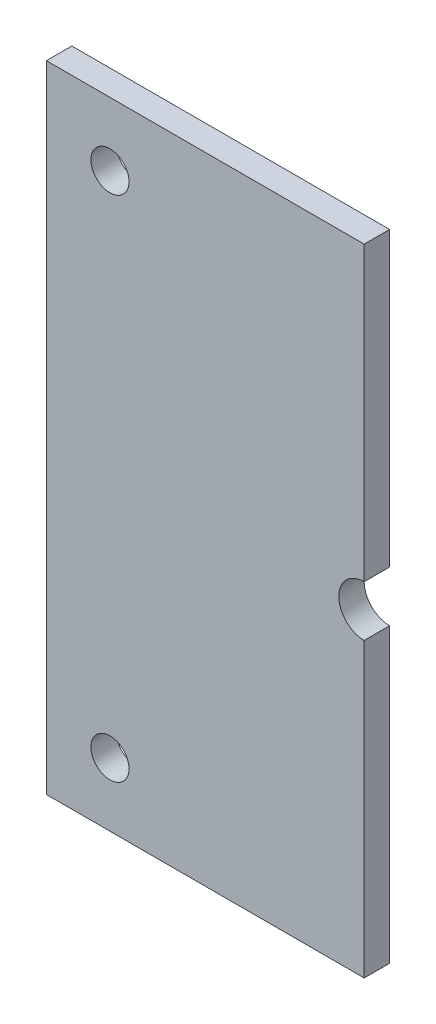
ISO-10303-21;
HEADER;
FILE_DESCRIPTION(('STEP AP214'),'2;1');
FILE_NAME('part.step','',(''),(''),'','','');
FILE_SCHEMA(('AUTOMOTIVE_DESIGN { 1 0 10303 214 1 1 1 1 }'));
ENDSEC;
DATA;
#1=APPLICATION_CONTEXT('core data for automotive mechanical design processes');
#2=APPLICATION_PROTOCOL_DEFINITION('international standard','automotive_design',2000,#1);
#3=PRODUCT_CONTEXT('',#1,'mechanical');
#4=PRODUCT('Part','Part','',(#3));
#5=PRODUCT_RELATED_PRODUCT_CATEGORY('part','',(#4));
#6=PRODUCT_DEFINITION_FORMATION('','',#4);
#7=PRODUCT_DEFINITION_CONTEXT('part definition',#1,'design');
#8=PRODUCT_DEFINITION('design','',#6,#7);
#9=PRODUCT_DEFINITION_SHAPE('','',#8);
#10=(LENGTH_UNIT() NAMED_UNIT(*) SI_UNIT(.MILLI.,.METRE.));
#11=(NAMED_UNIT(*) PLANE_ANGLE_UNIT() SI_UNIT($,.RADIAN.));
#12=(NAMED_UNIT(*) SI_UNIT($,.STERADIAN.) SOLID_ANGLE_UNIT());
#13=UNCERTAINTY_MEASURE_WITH_UNIT(LENGTH_MEASURE(1.E-05),#10,'distance_accuracy_value','');
#14=(GEOMETRIC_REPRESENTATION_CONTEXT(3) GLOBAL_UNCERTAINTY_ASSIGNED_CONTEXT((#13)) GLOBAL_UNIT_ASSIGNED_CONTEXT((#10,
#11,#12)) REPRESENTATION_CONTEXT('',''));
#15=CARTESIAN_POINT('',(0.,0.,0.));
#16=DIRECTION('',(0.,0.,1.));
#17=DIRECTION('',(1.,0.,0.));
#18=AXIS2_PLACEMENT_3D('',#15,#16,#17);
#19=CARTESIAN_POINT('',(0.,0.,2.));
#20=DIRECTION('',(0.,0.,1.));
#21=DIRECTION('',(1.,0.,0.));
#22=AXIS2_PLACEMENT_3D('',#19,#20,#21);
#23=PLANE('',#22);
#24=DIRECTION('',(0.,-1.,0.));
#25=VECTOR('',#24,1.);
#26=CARTESIAN_POINT('',(0.,27.5406495335132,2.));
#27=LINE('',#26,#25);
#28=CARTESIAN_POINT('',(0.,25.,2.));
#29=VERTEX_POINT('',#28);
#30=CARTESIAN_POINT('',(0.,2.,2.));
#31=VERTEX_POINT('',#30);
#32=EDGE_CURVE('E54',#29,#31,#27,.T.);
#33=ORIENTED_EDGE('',*,*,#32,.F.);
#34=DIRECTION('',(-1.,0.,0.));
#35=VECTOR('',#34,1.);
#36=CARTESIAN_POINT('',(-25.,25.,2.));
#37=LINE('',#36,#35);
#38=CARTESIAN_POINT('',(-25.,25.,2.));
#39=VERTEX_POINT('',#38);
#40=EDGE_CURVE('E95',#29,#39,#37,.T.);
#41=ORIENTED_EDGE('',*,*,#40,.T.);
#42=DIRECTION('',(0.,-1.,0.));
#43=VECTOR('',#42,1.);
#44=CARTESIAN_POINT('',(-25.,25.,2.));
#45=LINE('',#44,#43);
#46=CARTESIAN_POINT('',(-25.,-25.,2.));
#47=VERTEX_POINT('',#46);
#48=EDGE_CURVE('E111',#39,#47,#45,.T.);
#49=ORIENTED_EDGE('',*,*,#48,.T.);
#50=DIRECTION('',(1.,0.,0.));
#51=VECTOR('',#50,1.);
#52=CARTESIAN_POINT('',(-25.,-25.,2.));
#53=LINE('',#52,#51);
#54=CARTESIAN_POINT('',(0.,-25.,2.));
#55=VERTEX_POINT('',#54);
#56=EDGE_CURVE('E106',#47,#55,#53,.T.);
#57=ORIENTED_EDGE('',*,*,#56,.T.);
#58=CARTESIAN_POINT('',(0.,-2.,2.));
#59=VERTEX_POINT('',#58);
#60=EDGE_CURVE('E100',#59,#55,#27,.T.);
#61=ORIENTED_EDGE('',*,*,#60,.F.);
#62=CARTESIAN_POINT('',(0.,0.,2.));
#63=DIRECTION('',(0.,0.,1.));
#64=DIRECTION('',(1.,0.,0.));
#65=AXIS2_PLACEMENT_3D('',#62,#63,#64);
#66=CIRCLE('',#65,2.);
#67=EDGE_CURVE('E99',#31,#59,#66,.T.);
#68=ORIENTED_EDGE('',*,*,#67,.F.);
#69=EDGE_LOOP('',(#33,#41,#49,#57,#61,#68));
#70=FACE_BOUND('',#69,.T.);
#71=CARTESIAN_POINT('',(-20.,20.,2.));
#72=DIRECTION('',(0.,0.,1.));
#73=DIRECTION('',(1.,0.,0.));
#74=AXIS2_PLACEMENT_3D('',#71,#72,#73);
#75=CIRCLE('',#74,1.5);
#76=CARTESIAN_POINT('',(-18.5,20.,2.));
#77=VERTEX_POINT('',#76);
#78=EDGE_CURVE('E132',#77,#77,#75,.T.);
#79=ORIENTED_EDGE('',*,*,#78,.F.);
#80=EDGE_LOOP('',(#79));
#81=FACE_BOUND('',#80,.T.);
#82=CARTESIAN_POINT('',(-20.,-20.,2.));
#83=DIRECTION('',(0.,0.,1.));
#84=DIRECTION('',(-1.,0.,0.));
#85=AXIS2_PLACEMENT_3D('',#82,#83,#84);
#86=CIRCLE('',#85,1.5);
#87=CARTESIAN_POINT('',(-21.5,-20.,2.));
#88=VERTEX_POINT('',#87);
#89=EDGE_CURVE('E146',#88,#88,#86,.T.);
#90=ORIENTED_EDGE('',*,*,#89,.F.);
#91=EDGE_LOOP('',(#90));
#92=FACE_BOUND('',#91,.T.);
#93=ADVANCED_FACE('F32',(#70,#81,#92),#23,.T.);
#94=CARTESIAN_POINT('',(0.,0.,0.));
#95=DIRECTION('',(0.,0.,1.));
#96=DIRECTION('',(1.,0.,0.));
#97=AXIS2_PLACEMENT_3D('',#94,#95,#96);
#98=PLANE('',#97);
#99=CARTESIAN_POINT('',(-20.,20.,0.));
#100=DIRECTION('',(0.,0.,1.));
#101=DIRECTION('',(1.,0.,0.));
#102=AXIS2_PLACEMENT_3D('',#99,#100,#101);
#103=CIRCLE('',#102,1.5);
#104=CARTESIAN_POINT('',(-18.5,20.,0.));
#105=VERTEX_POINT('',#104);
#106=EDGE_CURVE('E135',#105,#105,#103,.T.);
#107=ORIENTED_EDGE('',*,*,#106,.T.);
#108=EDGE_LOOP('',(#107));
#109=FACE_BOUND('',#108,.T.);
#110=DIRECTION('',(-1.,0.,0.));
#111=VECTOR('',#110,1.);
#112=CARTESIAN_POINT('',(-25.,25.,0.));
#113=LINE('',#112,#111);
#114=CARTESIAN_POINT('',(0.,25.,0.));
#115=VERTEX_POINT('',#114);
#116=CARTESIAN_POINT('',(-25.,25.,0.));
#117=VERTEX_POINT('',#116);
#118=EDGE_CURVE('E121',#115,#117,#113,.T.);
#119=ORIENTED_EDGE('',*,*,#118,.F.);
#120=DIRECTION('',(0.,-1.,0.));
#121=VECTOR('',#120,1.);
#122=CARTESIAN_POINT('',(0.,0.,0.));
#123=LINE('',#122,#121);
#124=CARTESIAN_POINT('',(0.,2.,0.));
#125=VERTEX_POINT('',#124);
#126=EDGE_CURVE('E85',#115,#125,#123,.T.);
#127=ORIENTED_EDGE('',*,*,#126,.T.);
#128=CARTESIAN_POINT('',(0.,0.,0.));
#129=DIRECTION('',(0.,0.,1.));
#130=DIRECTION('',(1.,0.,0.));
#131=AXIS2_PLACEMENT_3D('',#128,#129,#130);
#132=CIRCLE('',#131,2.);
#133=CARTESIAN_POINT('',(0.,-2.,0.));
#134=VERTEX_POINT('',#133);
#135=EDGE_CURVE('E130',#125,#134,#132,.T.);
#136=ORIENTED_EDGE('',*,*,#135,.T.);
#137=CARTESIAN_POINT('',(0.,-25.,0.));
#138=VERTEX_POINT('',#137);
#139=EDGE_CURVE('E47',#134,#138,#123,.T.);
#140=ORIENTED_EDGE('',*,*,#139,.T.);
#141=DIRECTION('',(1.,0.,0.));
#142=VECTOR('',#141,1.);
#143=CARTESIAN_POINT('',(-25.,-25.,0.));
#144=LINE('',#143,#142);
#145=CARTESIAN_POINT('',(-25.,-25.,0.));
#146=VERTEX_POINT('',#145);
#147=EDGE_CURVE('E118',#146,#138,#144,.T.);
#148=ORIENTED_EDGE('',*,*,#147,.F.);
#149=DIRECTION('',(0.,-1.,0.));
#150=VECTOR('',#149,1.);
#151=CARTESIAN_POINT('',(-25.,25.,0.));
#152=LINE('',#151,#150);
#153=EDGE_CURVE('E115',#117,#146,#152,.T.);
#154=ORIENTED_EDGE('',*,*,#153,.F.);
#155=EDGE_LOOP('',(#119,#127,#136,#140,#148,#154));
#156=FACE_BOUND('',#155,.T.);
#157=CARTESIAN_POINT('',(-20.,-20.,0.));
#158=DIRECTION('',(0.,0.,1.));
#159=DIRECTION('',(-1.,0.,0.));
#160=AXIS2_PLACEMENT_3D('',#157,#158,#159);
#161=CIRCLE('',#160,1.5);
#162=CARTESIAN_POINT('',(-21.5,-20.,0.));
#163=VERTEX_POINT('',#162);
#164=EDGE_CURVE('E89',#163,#163,#161,.T.);
#165=ORIENTED_EDGE('',*,*,#164,.T.);
#166=EDGE_LOOP('',(#165));
#167=FACE_BOUND('',#166,.T.);
#168=ADVANCED_FACE('F156',(#109,#156,#167),#98,.F.);
#169=CARTESIAN_POINT('',(-25.,25.,2.));
#170=DIRECTION('',(1.,0.,0.));
#171=DIRECTION('',(0.,1.,0.));
#172=AXIS2_PLACEMENT_3D('',#169,#170,#171);
#173=PLANE('',#172);
#174=ORIENTED_EDGE('',*,*,#153,.T.);
#175=DIRECTION('',(0.,0.,-1.));
#176=VECTOR('',#175,1.);
#177=CARTESIAN_POINT('',(-25.,-25.,2.));
#178=LINE('',#177,#176);
#179=EDGE_CURVE('E108',#47,#146,#178,.T.);
#180=ORIENTED_EDGE('',*,*,#179,.F.);
#181=ORIENTED_EDGE('',*,*,#48,.F.);
#182=DIRECTION('',(0.,0.,-1.));
#183=VECTOR('',#182,1.);
#184=CARTESIAN_POINT('',(-25.,25.,2.));
#185=LINE('',#184,#183);
#186=EDGE_CURVE('E104',#39,#117,#185,.T.);
#187=ORIENTED_EDGE('',*,*,#186,.T.);
#188=EDGE_LOOP('',(#174,#180,#181,#187));
#189=FACE_BOUND('',#188,.T.);
#190=ADVANCED_FACE('F34',(#189),#173,.F.);
#191=CARTESIAN_POINT('',(-25.,-25.,2.));
#192=DIRECTION('',(0.,1.,0.));
#193=DIRECTION('',(0.,0.,1.));
#194=AXIS2_PLACEMENT_3D('',#191,#192,#193);
#195=PLANE('',#194);
#196=ORIENTED_EDGE('',*,*,#147,.T.);
#197=DIRECTION('',(0.,0.,1.));
#198=VECTOR('',#197,1.);
#199=CARTESIAN_POINT('',(0.,-25.,2.));
#200=LINE('',#199,#198);
#201=EDGE_CURVE('E142',#138,#55,#200,.T.);
#202=ORIENTED_EDGE('',*,*,#201,.T.);
#203=ORIENTED_EDGE('',*,*,#56,.F.);
#204=ORIENTED_EDGE('',*,*,#179,.T.);
#205=EDGE_LOOP('',(#196,#202,#203,#204));
#206=FACE_BOUND('',#205,.T.);
#207=ADVANCED_FACE('F141',(#206),#195,.F.);
#208=CARTESIAN_POINT('',(-25.,25.,2.));
#209=DIRECTION('',(0.,-1.,0.));
#210=DIRECTION('',(0.,0.,-1.));
#211=AXIS2_PLACEMENT_3D('',#208,#209,#210);
#212=PLANE('',#211);
#213=ORIENTED_EDGE('',*,*,#40,.F.);
#214=DIRECTION('',(0.,0.,-1.));
#215=VECTOR('',#214,1.);
#216=CARTESIAN_POINT('',(0.,25.,2.));
#217=LINE('',#216,#215);
#218=EDGE_CURVE('E82',#29,#115,#217,.T.);
#219=ORIENTED_EDGE('',*,*,#218,.T.);
#220=ORIENTED_EDGE('',*,*,#118,.T.);
#221=ORIENTED_EDGE('',*,*,#186,.F.);
#222=EDGE_LOOP('',(#213,#219,#220,#221));
#223=FACE_BOUND('',#222,.T.);
#224=ADVANCED_FACE('F102',(#223),#212,.F.);
#225=CARTESIAN_POINT('',(0.,0.,2.));
#226=DIRECTION('',(0.,0.,-1.));
#227=DIRECTION('',(-1.,0.,0.));
#228=AXIS2_PLACEMENT_3D('',#225,#226,#227);
#229=CYLINDRICAL_SURFACE('',#228,2.);
#230=DIRECTION('',(0.,0.,-1.));
#231=VECTOR('',#230,1.);
#232=CARTESIAN_POINT('',(0.,2.,2.));
#233=LINE('',#232,#231);
#234=EDGE_CURVE('E11',#31,#125,#233,.T.);
#235=ORIENTED_EDGE('',*,*,#234,.F.);
#236=ORIENTED_EDGE('',*,*,#67,.T.);
#237=DIRECTION('',(0.,0.,-1.));
#238=VECTOR('',#237,1.);
#239=CARTESIAN_POINT('',(0.,-2.,2.));
#240=LINE('',#239,#238);
#241=EDGE_CURVE('E40',#134,#59,#240,.F.);
#242=ORIENTED_EDGE('',*,*,#241,.F.);
#243=ORIENTED_EDGE('',*,*,#135,.F.);
#244=EDGE_LOOP('',(#235,#236,#242,#243));
#245=FACE_BOUND('',#244,.T.);
#246=ADVANCED_FACE('F129',(#245),#229,.F.);
#247=CARTESIAN_POINT('',(-20.,20.,2.));
#248=DIRECTION('',(0.,0.,-1.));
#249=DIRECTION('',(-1.,0.,0.));
#250=AXIS2_PLACEMENT_3D('',#247,#248,#249);
#251=CYLINDRICAL_SURFACE('',#250,1.5);
#252=ORIENTED_EDGE('',*,*,#78,.T.);
#253=EDGE_LOOP('',(#252));
#254=FACE_BOUND('',#253,.T.);
#255=ORIENTED_EDGE('',*,*,#106,.F.);
#256=EDGE_LOOP('',(#255));
#257=FACE_BOUND('',#256,.T.);
#258=ADVANCED_FACE('F159',(#254,#257),#251,.F.);
#259=CARTESIAN_POINT('',(-20.,-20.,2.));
#260=DIRECTION('',(0.,0.,-1.));
#261=DIRECTION('',(-1.,0.,0.));
#262=AXIS2_PLACEMENT_3D('',#259,#260,#261);
#263=CYLINDRICAL_SURFACE('',#262,1.5);
#264=ORIENTED_EDGE('',*,*,#89,.T.);
#265=EDGE_LOOP('',(#264));
#266=FACE_BOUND('',#265,.T.);
#267=ORIENTED_EDGE('',*,*,#164,.F.);
#268=EDGE_LOOP('',(#267));
#269=FACE_BOUND('',#268,.T.);
#270=ADVANCED_FACE('F161',(#266,#269),#263,.F.);
#271=CARTESIAN_POINT('',(0.,27.5406495335132,-8.));
#272=DIRECTION('',(-1.,0.,0.));
#273=DIRECTION('',(0.,0.,1.));
#274=AXIS2_PLACEMENT_3D('',#271,#272,#273);
#275=PLANE('',#274);
#276=ORIENTED_EDGE('',*,*,#139,.F.);
#277=ORIENTED_EDGE('',*,*,#241,.T.);
#278=ORIENTED_EDGE('',*,*,#60,.T.);
#279=ORIENTED_EDGE('',*,*,#201,.F.);
#280=EDGE_LOOP('',(#276,#277,#278,#279));
#281=FACE_BOUND('',#280,.T.);
#282=ADVANCED_FACE('F124',(#281),#275,.F.);
#283=ORIENTED_EDGE('',*,*,#32,.T.);
#284=ORIENTED_EDGE('',*,*,#234,.T.);
#285=ORIENTED_EDGE('',*,*,#126,.F.);
#286=ORIENTED_EDGE('',*,*,#218,.F.);
#287=EDGE_LOOP('',(#283,#284,#285,#286));
#288=FACE_BOUND('',#287,.T.);
#289=ADVANCED_FACE('F83',(#288),#275,.F.);
#290=CLOSED_SHELL('',(#93,#168,#190,#207,#224,#246,#258,#270,#282,#289));
#291=MANIFOLD_SOLID_BREP('B2',#290);
#292=ADVANCED_BREP_SHAPE_REPRESENTATION('',(#18,#291),#14);
#293=SHAPE_DEFINITION_REPRESENTATION(#9,#292);
ENDSEC;
END-ISO-10303-21;
